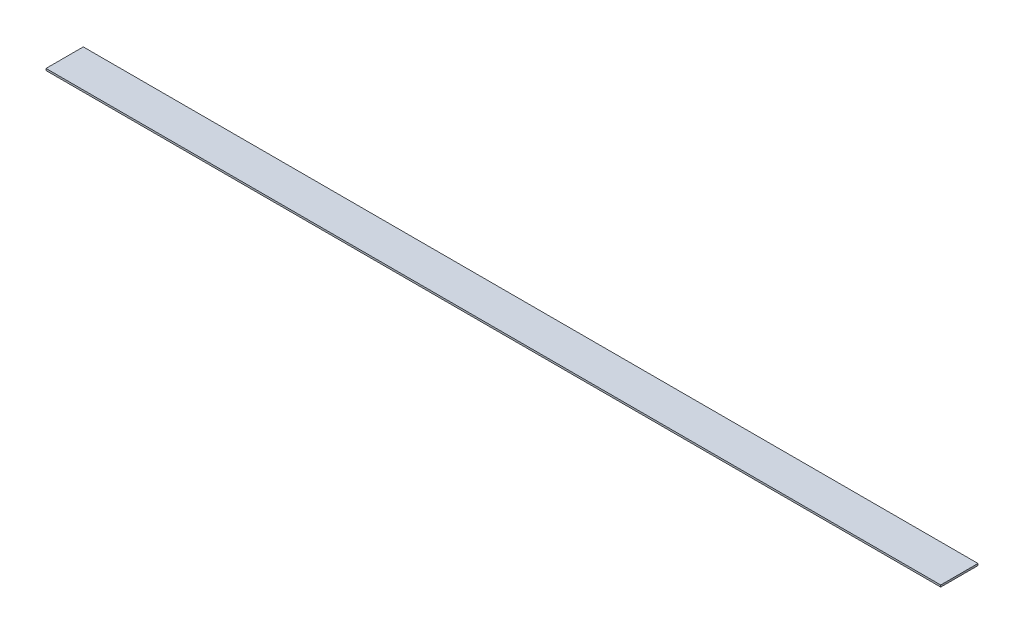
ISO-10303-21;
HEADER;
FILE_DESCRIPTION(('STEP AP214'),'2;1');
FILE_NAME('part.step','',(''),(''),'','','');
FILE_SCHEMA(('AUTOMOTIVE_DESIGN { 1 0 10303 214 1 1 1 1 }'));
ENDSEC;
DATA;
#1=APPLICATION_CONTEXT('core data for automotive mechanical design processes');
#2=APPLICATION_PROTOCOL_DEFINITION('international standard','automotive_design',2000,#1);
#3=PRODUCT_CONTEXT('',#1,'mechanical');
#4=PRODUCT('Part','Part','',(#3));
#5=PRODUCT_RELATED_PRODUCT_CATEGORY('part','',(#4));
#6=PRODUCT_DEFINITION_FORMATION('','',#4);
#7=PRODUCT_DEFINITION_CONTEXT('part definition',#1,'design');
#8=PRODUCT_DEFINITION('design','',#6,#7);
#9=PRODUCT_DEFINITION_SHAPE('','',#8);
#10=(LENGTH_UNIT() NAMED_UNIT(*) SI_UNIT(.MILLI.,.METRE.));
#11=(NAMED_UNIT(*) PLANE_ANGLE_UNIT() SI_UNIT($,.RADIAN.));
#12=(NAMED_UNIT(*) SI_UNIT($,.STERADIAN.) SOLID_ANGLE_UNIT());
#13=UNCERTAINTY_MEASURE_WITH_UNIT(LENGTH_MEASURE(1.E-05),#10,'distance_accuracy_value','');
#14=(GEOMETRIC_REPRESENTATION_CONTEXT(3) GLOBAL_UNCERTAINTY_ASSIGNED_CONTEXT((#13)) GLOBAL_UNIT_ASSIGNED_CONTEXT((#10,
#11,#12)) REPRESENTATION_CONTEXT('',''));
#15=CARTESIAN_POINT('',(0.,0.,0.));
#16=DIRECTION('',(0.,0.,1.));
#17=DIRECTION('',(1.,0.,0.));
#18=AXIS2_PLACEMENT_3D('',#15,#16,#17);
#19=CARTESIAN_POINT('',(0.,0.,0.));
#20=DIRECTION('',(0.,1.,0.));
#21=DIRECTION('',(0.,0.,1.));
#22=AXIS2_PLACEMENT_3D('',#19,#20,#21);
#23=PLANE('',#22);
#24=DIRECTION('',(1.,0.,0.));
#25=VECTOR('',#24,1.);
#26=CARTESIAN_POINT('',(0.,0.,-25.4));
#27=LINE('',#26,#25);
#28=CARTESIAN_POINT('',(0.,0.,-25.4));
#29=VERTEX_POINT('',#28);
#30=CARTESIAN_POINT('',(1219.2,0.,-25.4));
#31=VERTEX_POINT('',#30);
#32=EDGE_CURVE('E81',#29,#31,#27,.T.);
#33=ORIENTED_EDGE('',*,*,#32,.T.);
#34=DIRECTION('',(0.,0.,1.));
#35=VECTOR('',#34,1.);
#36=CARTESIAN_POINT('',(1219.2,0.,-25.4));
#37=LINE('',#36,#35);
#38=CARTESIAN_POINT('',(1219.2,0.,25.3999999999994));
#39=VERTEX_POINT('',#38);
#40=EDGE_CURVE('E68',#31,#39,#37,.T.);
#41=ORIENTED_EDGE('',*,*,#40,.T.);
#42=DIRECTION('',(-1.,0.,0.));
#43=VECTOR('',#42,1.);
#44=CARTESIAN_POINT('',(0.,0.,25.4));
#45=LINE('',#44,#43);
#46=CARTESIAN_POINT('',(0.,0.,25.4));
#47=VERTEX_POINT('',#46);
#48=EDGE_CURVE('E55',#39,#47,#45,.T.);
#49=ORIENTED_EDGE('',*,*,#48,.T.);
#50=DIRECTION('',(0.,0.,-1.));
#51=VECTOR('',#50,1.);
#52=CARTESIAN_POINT('',(0.,0.,-25.4));
#53=LINE('',#52,#51);
#54=EDGE_CURVE('E20',#47,#29,#53,.T.);
#55=ORIENTED_EDGE('',*,*,#54,.T.);
#56=EDGE_LOOP('',(#33,#41,#49,#55));
#57=FACE_BOUND('',#56,.T.);
#58=ADVANCED_FACE('F17',(#57),#23,.F.);
#59=CARTESIAN_POINT('',(0.,2.54,-25.4));
#60=DIRECTION('',(1.,0.,0.));
#61=DIRECTION('',(0.,0.,-1.));
#62=AXIS2_PLACEMENT_3D('',#59,#60,#61);
#63=PLANE('',#62);
#64=DIRECTION('',(0.,1.,0.));
#65=VECTOR('',#64,1.);
#66=CARTESIAN_POINT('',(0.,2.54,25.4));
#67=LINE('',#66,#65);
#68=CARTESIAN_POINT('',(0.,2.54,25.4));
#69=VERTEX_POINT('',#68);
#70=EDGE_CURVE('E61',#47,#69,#67,.T.);
#71=ORIENTED_EDGE('',*,*,#70,.T.);
#72=DIRECTION('',(0.,0.,1.));
#73=VECTOR('',#72,1.);
#74=CARTESIAN_POINT('',(0.,2.54,0.));
#75=LINE('',#74,#73);
#76=CARTESIAN_POINT('',(0.,2.54,-25.4));
#77=VERTEX_POINT('',#76);
#78=EDGE_CURVE('E83',#77,#69,#75,.T.);
#79=ORIENTED_EDGE('',*,*,#78,.F.);
#80=DIRECTION('',(0.,1.,0.));
#81=VECTOR('',#80,1.);
#82=CARTESIAN_POINT('',(0.,2.54,-25.4));
#83=LINE('',#82,#81);
#84=EDGE_CURVE('E64',#77,#29,#83,.F.);
#85=ORIENTED_EDGE('',*,*,#84,.T.);
#86=ORIENTED_EDGE('',*,*,#54,.F.);
#87=EDGE_LOOP('',(#71,#79,#85,#86));
#88=FACE_BOUND('',#87,.T.);
#89=ADVANCED_FACE('F60',(#88),#63,.F.);
#90=CARTESIAN_POINT('',(0.,2.54,25.4));
#91=DIRECTION('',(0.,0.,-1.));
#92=DIRECTION('',(-1.,0.,0.));
#93=AXIS2_PLACEMENT_3D('',#90,#91,#92);
#94=PLANE('',#93);
#95=DIRECTION('',(0.,1.,0.));
#96=VECTOR('',#95,1.);
#97=CARTESIAN_POINT('',(1219.2,2.54,25.3999999999992));
#98=LINE('',#97,#96);
#99=CARTESIAN_POINT('',(1219.2,2.54,25.3999999999994));
#100=VERTEX_POINT('',#99);
#101=EDGE_CURVE('E70',#39,#100,#98,.T.);
#102=ORIENTED_EDGE('',*,*,#101,.T.);
#103=DIRECTION('',(1.,0.,0.));
#104=VECTOR('',#103,1.);
#105=CARTESIAN_POINT('',(0.,2.54,25.4));
#106=LINE('',#105,#104);
#107=EDGE_CURVE('E74',#69,#100,#106,.T.);
#108=ORIENTED_EDGE('',*,*,#107,.F.);
#109=ORIENTED_EDGE('',*,*,#70,.F.);
#110=ORIENTED_EDGE('',*,*,#48,.F.);
#111=EDGE_LOOP('',(#102,#108,#109,#110));
#112=FACE_BOUND('',#111,.T.);
#113=ADVANCED_FACE('F72',(#112),#94,.F.);
#114=CARTESIAN_POINT('',(1219.2,2.54,-25.4));
#115=DIRECTION('',(-1.,0.,0.));
#116=DIRECTION('',(0.,0.,1.));
#117=AXIS2_PLACEMENT_3D('',#114,#115,#116);
#118=PLANE('',#117);
#119=DIRECTION('',(0.,1.,0.));
#120=VECTOR('',#119,1.);
#121=CARTESIAN_POINT('',(1219.2,2.54,-25.4));
#122=LINE('',#121,#120);
#123=CARTESIAN_POINT('',(1219.2,2.54,-25.4));
#124=VERTEX_POINT('',#123);
#125=EDGE_CURVE('E35',#31,#124,#122,.T.);
#126=ORIENTED_EDGE('',*,*,#125,.T.);
#127=DIRECTION('',(0.,0.,1.));
#128=VECTOR('',#127,1.);
#129=CARTESIAN_POINT('',(1219.2,2.54,0.));
#130=LINE('',#129,#128);
#131=EDGE_CURVE('E26',#100,#124,#130,.F.);
#132=ORIENTED_EDGE('',*,*,#131,.F.);
#133=ORIENTED_EDGE('',*,*,#101,.F.);
#134=ORIENTED_EDGE('',*,*,#40,.F.);
#135=EDGE_LOOP('',(#126,#132,#133,#134));
#136=FACE_BOUND('',#135,.T.);
#137=ADVANCED_FACE('F89',(#136),#118,.F.);
#138=CARTESIAN_POINT('',(0.,2.54,-25.4));
#139=DIRECTION('',(0.,0.,1.));
#140=DIRECTION('',(1.,0.,0.));
#141=AXIS2_PLACEMENT_3D('',#138,#139,#140);
#142=PLANE('',#141);
#143=ORIENTED_EDGE('',*,*,#84,.F.);
#144=DIRECTION('',(1.,0.,0.));
#145=VECTOR('',#144,1.);
#146=CARTESIAN_POINT('',(0.,2.54,-25.4));
#147=LINE('',#146,#145);
#148=EDGE_CURVE('E11',#124,#77,#147,.F.);
#149=ORIENTED_EDGE('',*,*,#148,.F.);
#150=ORIENTED_EDGE('',*,*,#125,.F.);
#151=ORIENTED_EDGE('',*,*,#32,.F.);
#152=EDGE_LOOP('',(#143,#149,#150,#151));
#153=FACE_BOUND('',#152,.T.);
#154=ADVANCED_FACE('F91',(#153),#142,.F.);
#155=CARTESIAN_POINT('',(0.,2.54,0.));
#156=DIRECTION('',(0.,1.,0.));
#157=DIRECTION('',(0.,0.,1.));
#158=AXIS2_PLACEMENT_3D('',#155,#156,#157);
#159=PLANE('',#158);
#160=ORIENTED_EDGE('',*,*,#131,.T.);
#161=ORIENTED_EDGE('',*,*,#148,.T.);
#162=ORIENTED_EDGE('',*,*,#78,.T.);
#163=ORIENTED_EDGE('',*,*,#107,.T.);
#164=EDGE_LOOP('',(#160,#161,#162,#163));
#165=FACE_BOUND('',#164,.T.);
#166=ADVANCED_FACE('F88',(#165),#159,.T.);
#167=CLOSED_SHELL('',(#58,#89,#113,#137,#154,#166));
#168=MANIFOLD_SOLID_BREP('B1',#167);
#169=ADVANCED_BREP_SHAPE_REPRESENTATION('',(#18,#168),#14);
#170=SHAPE_DEFINITION_REPRESENTATION(#9,#169);
ENDSEC;
END-ISO-10303-21;
